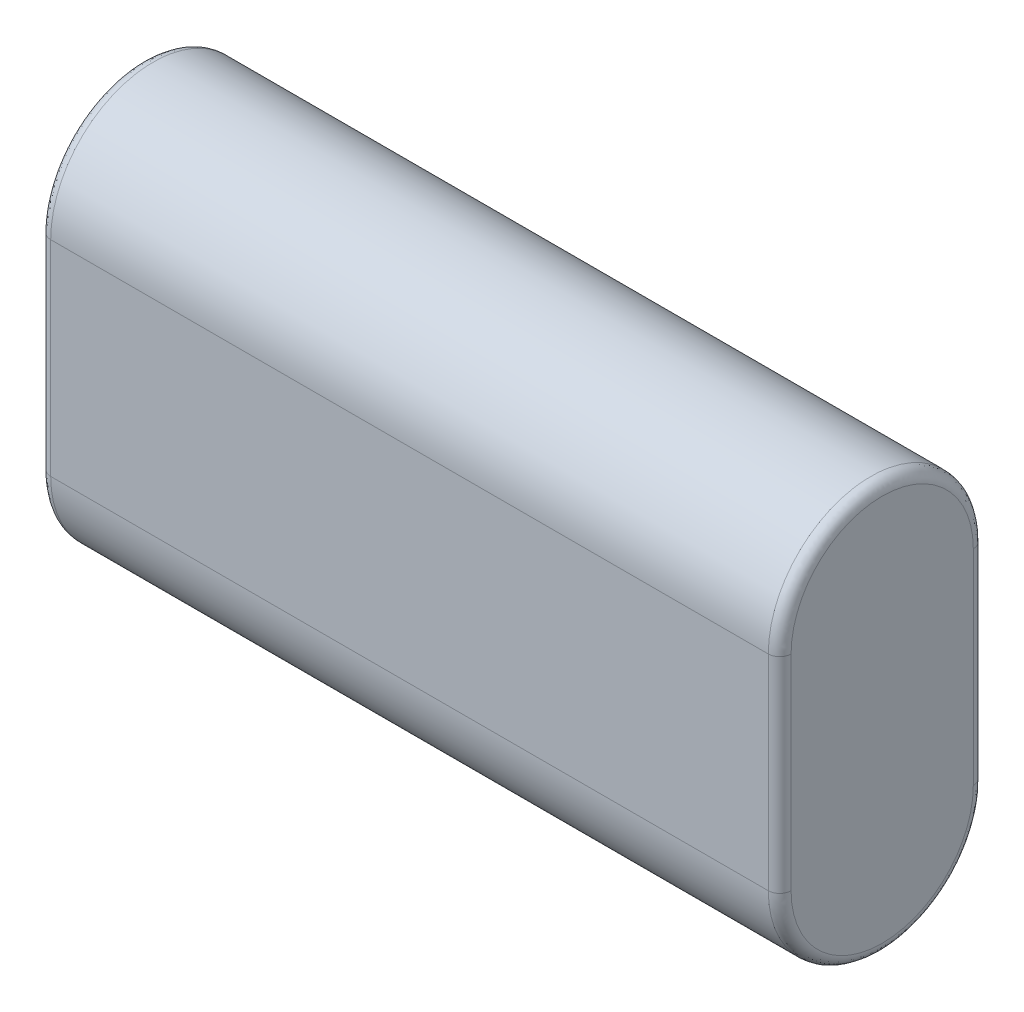
ISO-10303-21;
HEADER;
FILE_DESCRIPTION(('STEP AP214'),'2;1');
FILE_NAME('part.step','',(''),(''),'','','');
FILE_SCHEMA(('AUTOMOTIVE_DESIGN { 1 0 10303 214 1 1 1 1 }'));
ENDSEC;
DATA;
#1=APPLICATION_CONTEXT('core data for automotive mechanical design processes');
#2=APPLICATION_PROTOCOL_DEFINITION('international standard','automotive_design',2000,#1);
#3=PRODUCT_CONTEXT('',#1,'mechanical');
#4=PRODUCT('Part','Part','',(#3));
#5=PRODUCT_RELATED_PRODUCT_CATEGORY('part','',(#4));
#6=PRODUCT_DEFINITION_FORMATION('','',#4);
#7=PRODUCT_DEFINITION_CONTEXT('part definition',#1,'design');
#8=PRODUCT_DEFINITION('design','',#6,#7);
#9=PRODUCT_DEFINITION_SHAPE('','',#8);
#10=(LENGTH_UNIT() NAMED_UNIT(*) SI_UNIT(.MILLI.,.METRE.));
#11=(NAMED_UNIT(*) PLANE_ANGLE_UNIT() SI_UNIT($,.RADIAN.));
#12=(NAMED_UNIT(*) SI_UNIT($,.STERADIAN.) SOLID_ANGLE_UNIT());
#13=UNCERTAINTY_MEASURE_WITH_UNIT(LENGTH_MEASURE(1.E-05),#10,'distance_accuracy_value','');
#14=(GEOMETRIC_REPRESENTATION_CONTEXT(3) GLOBAL_UNCERTAINTY_ASSIGNED_CONTEXT((#13)) GLOBAL_UNIT_ASSIGNED_CONTEXT((#10,
#11,#12)) REPRESENTATION_CONTEXT('',''));
#15=CARTESIAN_POINT('',(0.,0.,0.));
#16=DIRECTION('',(0.,0.,1.));
#17=DIRECTION('',(1.,0.,0.));
#18=AXIS2_PLACEMENT_3D('',#15,#16,#17);
#19=CARTESIAN_POINT('',(275.333688616931,-22.3893536522053,61.1643742049061));
#20=DIRECTION('',(-1.33507032488976E-12,1.,-1.30664861545941E-12));
#21=DIRECTION('',(1.,1.33507032488976E-12,0.));
#22=AXIS2_PLACEMENT_3D('',#19,#20,#21);
#23=CYLINDRICAL_SURFACE('',#22,0.999999999999943);
#24=CARTESIAN_POINT('',(275.333688616931,-13.3893536522568,60.1643742049062));
#25=CARTESIAN_POINT('',(275.333688616931,-31.3893536521565,60.1643742049062));
#26=(BOUNDED_CURVE() B_SPLINE_CURVE(1,(#24,#25),.UNSPECIFIED.,.F.,
.F.) B_SPLINE_CURVE_WITH_KNOTS((2,2),(0.,17.9999999998998),
.UNSPECIFIED.) CURVE() GEOMETRIC_REPRESENTATION_ITEM() RATIONAL_B_SPLINE_CURVE((1.,1.)) REPRESENTATION_ITEM(''));
#27=CARTESIAN_POINT('',(275.333688616931,-13.3893536522568,60.1643742049062));
#28=VERTEX_POINT('',#27);
#29=CARTESIAN_POINT('',(275.333688616931,-31.3893536521565,60.1643742049062));
#30=VERTEX_POINT('',#29);
#31=EDGE_CURVE('E167',#28,#30,#26,.T.);
#32=ORIENTED_EDGE('',*,*,#31,.T.);
#33=CARTESIAN_POINT('',(275.333688615059,-31.389353652161,61.1643742030338));
#34=DIRECTION('',(-6.84223817983434E-12,1.,4.52615722245532E-12));
#35=DIRECTION('',(1.87236537736192E-09,4.52615723526649E-12,-1.));
#36=AXIS2_PLACEMENT_3D('',#33,#34,#35);
#37=CIRCLE('',#36,0.999999998127628);
#38=CARTESIAN_POINT('',(274.333688616931,-31.3893536521679,61.1643742027126));
#39=VERTEX_POINT('',#38);
#40=EDGE_CURVE('E265',#30,#39,#37,.T.);
#41=ORIENTED_EDGE('',*,*,#40,.T.);
#42=CARTESIAN_POINT('',(274.333688616931,-13.3893536522569,61.1643742027126));
#43=CARTESIAN_POINT('',(274.333688616931,-31.3893536521679,61.1643742027126));
#44=(BOUNDED_CURVE() B_SPLINE_CURVE(1,(#42,#43),.UNSPECIFIED.,.F.,
.F.) B_SPLINE_CURVE_WITH_KNOTS((2,2),(0.,17.9999999998998),
.UNSPECIFIED.) CURVE() GEOMETRIC_REPRESENTATION_ITEM() RATIONAL_B_SPLINE_CURVE((1.,1.)) REPRESENTATION_ITEM(''));
#45=CARTESIAN_POINT('',(274.333688616931,-13.3893536522569,61.1643742027126));
#46=VERTEX_POINT('',#45);
#47=EDGE_CURVE('E236',#46,#39,#44,.T.);
#48=ORIENTED_EDGE('',*,*,#47,.F.);
#49=CARTESIAN_POINT('',(275.333688615059,-13.3893536522557,61.1643742030337));
#50=DIRECTION('',(1.17239551585976E-12,-1.,1.05816782335625E-12));
#51=DIRECTION('',(-1.,-1.17239551619952E-12,-3.21087157463879E-10));
#52=AXIS2_PLACEMENT_3D('',#49,#50,#51);
#53=CIRCLE('',#52,0.999999998127464);
#54=EDGE_CURVE('E11',#46,#28,#53,.T.);
#55=ORIENTED_EDGE('',*,*,#54,.T.);
#56=EDGE_LOOP('',(#32,#41,#48,#55));
#57=FACE_BOUND('',#56,.T.);
#58=ADVANCED_FACE('F51',(#57),#23,.T.);
#59=CARTESIAN_POINT('',(338.333688616931,-22.3893536522086,61.164374204906));
#60=DIRECTION('',(2.21530666022311E-12,-1.,-2.07319811307117E-12));
#61=DIRECTION('',(1.,2.21530666022311E-12,0.));
#62=AXIS2_PLACEMENT_3D('',#59,#60,#61);
#63=CYLINDRICAL_SURFACE('',#62,0.999999999999964);
#64=CARTESIAN_POINT('',(338.333688618992,-13.3893536522681,61.1643742028455));
#65=DIRECTION('',(1.13119827194599E-11,-1.,-1.14255272378755E-11));
#66=DIRECTION('',(-2.06063078136926E-09,1.14255272145657E-11,-1.));
#67=AXIS2_PLACEMENT_3D('',#64,#65,#66);
#68=CIRCLE('',#67,0.999999997939412);
#69=CARTESIAN_POINT('',(338.333688616931,-13.3893536522566,60.1643742049061));
#70=VERTEX_POINT('',#69);
#71=CARTESIAN_POINT('',(339.333688616931,-13.3893536522568,61.1643742027125));
#72=VERTEX_POINT('',#71);
#73=EDGE_CURVE('E60',#70,#72,#68,.T.);
#74=ORIENTED_EDGE('',*,*,#73,.T.);
#75=CARTESIAN_POINT('',(339.333688616931,-13.3893536522568,61.1643742027125));
#76=CARTESIAN_POINT('',(339.333688616931,-31.3893536521678,61.1643742027125));
#77=(BOUNDED_CURVE() B_SPLINE_CURVE(1,(#75,#76),.UNSPECIFIED.,.F.,
.F.) B_SPLINE_CURVE_WITH_KNOTS((2,2),(-1.29674049276218E-13,17.9999999998997),
.UNSPECIFIED.) CURVE() GEOMETRIC_REPRESENTATION_ITEM() RATIONAL_B_SPLINE_CURVE((1.,1.)) REPRESENTATION_ITEM(''));
#78=CARTESIAN_POINT('',(339.333688616931,-31.3893536521677,61.1643742027125));
#79=VERTEX_POINT('',#78);
#80=EDGE_CURVE('E148',#72,#79,#77,.T.);
#81=ORIENTED_EDGE('',*,*,#80,.T.);
#82=CARTESIAN_POINT('',(338.333688618803,-31.389353652164,61.1643742030337));
#83=DIRECTION('',(-3.72903620133552E-12,-1.,-7.5566220019752E-12));
#84=DIRECTION('',(-1.87236537736188E-09,7.55662200895732E-12,-1.));
#85=AXIS2_PLACEMENT_3D('',#82,#83,#84);
#86=CIRCLE('',#85,0.999999998127649);
#87=CARTESIAN_POINT('',(338.333688616931,-31.3893536521565,60.1643742049061));
#88=VERTEX_POINT('',#87);
#89=EDGE_CURVE('E254',#88,#79,#86,.T.);
#90=ORIENTED_EDGE('',*,*,#89,.F.);
#91=CARTESIAN_POINT('',(338.333688616931,-13.3893536522566,60.1643742049061));
#92=CARTESIAN_POINT('',(338.333688616931,-31.3893536521565,60.1643742049061));
#93=(BOUNDED_CURVE() B_SPLINE_CURVE(1,(#91,#92),.UNSPECIFIED.,.F.,
.F.) B_SPLINE_CURVE_WITH_KNOTS((2,2),(-1.19015908239817E-13,17.9999999998997),
.UNSPECIFIED.) CURVE() GEOMETRIC_REPRESENTATION_ITEM() RATIONAL_B_SPLINE_CURVE((1.,1.)) REPRESENTATION_ITEM(''));
#94=EDGE_CURVE('E151',#70,#88,#93,.T.);
#95=ORIENTED_EDGE('',*,*,#94,.F.);
#96=EDGE_LOOP('',(#74,#81,#90,#95));
#97=FACE_BOUND('',#96,.T.);
#98=ADVANCED_FACE('F146',(#97),#63,.T.);
#99=CARTESIAN_POINT('',(275.333688616931,-13.3893536522567,78.1643742049061));
#100=CARTESIAN_POINT('',(274.333688616931,-13.3893536522567,78.1643742092933));
#101=CARTESIAN_POINT('',(274.333688616931,-13.389353652234,77.1643742092933));
#102=CARTESIAN_POINT('',(275.333688616931,-4.38935365215649,78.1643742050064));
#103=CARTESIAN_POINT('',(274.333688616931,-4.3893536477694,78.1643742093935));
#104=CARTESIAN_POINT('',(274.333688616931,-5.38935364775774,77.1643742093708));
#105=CARTESIAN_POINT('',(275.333688616931,-4.38935365215648,69.1643742049061));
#106=CARTESIAN_POINT('',(274.333688616931,-4.38935364776935,69.1643742049062));
#107=CARTESIAN_POINT('',(274.333688616931,-5.38935364776934,69.1643742048945));
#108=CARTESIAN_POINT('',(275.333688616931,-4.38935365215648,60.1643742048059));
#109=CARTESIAN_POINT('',(274.333688616931,-4.3893536477693,60.1643742004188));
#110=CARTESIAN_POINT('',(274.333688616931,-5.38935364778094,61.1643742004183));
#111=CARTESIAN_POINT('',(275.333688616931,-13.3893536522567,60.1643742049061));
#112=CARTESIAN_POINT('',(274.333688616931,-13.3893536522566,60.164374200519));
#113=CARTESIAN_POINT('',(274.333688616931,-13.3893536522572,61.164374200519));
#114=(BOUNDED_SURFACE() B_SPLINE_SURFACE(2,2,((#99,#100,#101),(#102,#103,#104),(#105,#106,#107),
(#108,#109,#110),(#111,#112,#113)),.UNSPECIFIED.,.F.,.F.,.F.) B_SPLINE_SURFACE_WITH_KNOTS((3,2,
3),(3,3),(0.,12.5660531298859,25.1321062597719),(0.,1.57079633337563),
.UNSPECIFIED.) GEOMETRIC_REPRESENTATION_ITEM() RATIONAL_B_SPLINE_SURFACE(((1.,0.707106778859905,
1.),(0.707106781182611,0.499999998352032,0.707106781182611),(1.,0.707106778859905,1.),
(0.707106781182611,0.499999998352032,0.707106781182611),(1.,0.707106778859905,1.))) REPRESENTATION_ITEM('') SURFACE());
#115=CARTESIAN_POINT('',(275.333688616931,-13.3893536521564,69.1643742049061));
#116=DIRECTION('',(-1.,0.,0.));
#117=DIRECTION('',(0.,-1.11422969616291E-11,1.));
#118=AXIS2_PLACEMENT_3D('',#115,#116,#117);
#119=CIRCLE('',#118,9.);
#120=CARTESIAN_POINT('',(275.333688616931,-13.3893536522568,78.1643742049062));
#121=VERTEX_POINT('',#120);
#122=EDGE_CURVE('E198',#121,#28,#119,.T.);
#123=CARTESIAN_POINT('',(274.333688616931,-13.3893536521564,69.1643742038093));
#124=DIRECTION('',(-1.,0.,0.));
#125=DIRECTION('',(0.,-1.11157749625801E-11,1.));
#126=AXIS2_PLACEMENT_3D('',#123,#124,#125);
#127=CIRCLE('',#126,8.0000000032904);
#128=CARTESIAN_POINT('',(274.333688616931,-13.3893536522454,77.1643742070997));
#129=VERTEX_POINT('',#128);
#130=EDGE_CURVE('E162',#129,#46,#127,.T.);
#131=CARTESIAN_POINT('',(275.333688615059,-13.3893536522525,77.1643742067786));
#132=DIRECTION('',(-7.08239444687799E-12,-1.,-4.28812540507981E-12));
#133=DIRECTION('',(1.87247906419997E-09,-4.28812541834145E-12,1.));
#134=AXIS2_PLACEMENT_3D('',#131,#132,#133);
#135=CIRCLE('',#134,0.999999998127564);
#136=EDGE_CURVE('E103',#121,#129,#135,.T.);
#137=ORIENTED_EDGE('',*,*,#122,.T.);
#138=ORIENTED_EDGE('',*,*,#54,.F.);
#139=ORIENTED_EDGE('',*,*,#130,.F.);
#140=ORIENTED_EDGE('',*,*,#136,.F.);
#141=EDGE_LOOP('',(#137,#138,#139,#140));
#142=FACE_BOUND('',#141,.T.);
#143=ADVANCED_FACE('F342',(#142),#114,.T.);
#144=CARTESIAN_POINT('',(338.333688616931,-13.3893536522566,78.1643742049061));
#145=CARTESIAN_POINT('',(338.333688616931,-4.3893536521564,78.1643742050062));
#146=CARTESIAN_POINT('',(338.333688616931,-4.38935365215643,69.164374204906));
#147=CARTESIAN_POINT('',(338.333688616931,-4.38935365215646,60.1643742048058));
#148=CARTESIAN_POINT('',(338.333688616931,-13.3893536522567,60.1643742049061));
#149=CARTESIAN_POINT('',(339.333688616931,-13.3893536522567,78.1643742092932));
#150=CARTESIAN_POINT('',(339.333688616931,-4.38935364776927,78.1643742093934));
#151=CARTESIAN_POINT('',(339.333688616931,-4.38935364776928,69.1643742049061));
#152=CARTESIAN_POINT('',(339.333688616931,-4.38935364776929,60.1643742004187));
#153=CARTESIAN_POINT('',(339.333688616931,-13.3893536522567,60.1643742005189));
#154=CARTESIAN_POINT('',(339.333688616931,-13.3893536522339,77.1643742092932));
#155=CARTESIAN_POINT('',(339.333688616931,-5.38935364775765,77.1643742093707));
#156=CARTESIAN_POINT('',(339.333688616931,-5.38935364776928,69.1643742048944));
#157=CARTESIAN_POINT('',(339.333688616931,-5.38935364778091,61.1643742004182));
#158=CARTESIAN_POINT('',(339.333688616931,-13.3893536522572,61.1643742005189));
#159=(BOUNDED_SURFACE() B_SPLINE_SURFACE(2,2,((#144,#145,#146,#147,#148),(#149,#150,#151,#152,
#153),(#154,#155,#156,#157,#158)),.UNSPECIFIED.,.F.,.F.,.F.) B_SPLINE_SURFACE_WITH_KNOTS((3,3),
(3,2,3),(0.,1.57079633337563),(0.,12.5660531298859,25.1321062597718),
.UNSPECIFIED.) GEOMETRIC_REPRESENTATION_ITEM() RATIONAL_B_SPLINE_SURFACE(((1.,0.70710678118261,
1.,0.70710678118261,1.),(0.707106778859906,0.499999998352031,0.707106778859906,
0.499999998352031,0.707106778859906),(1.,0.70710678118261,1.,0.70710678118261,1.))) REPRESENTATION_ITEM('') SURFACE());
#160=CARTESIAN_POINT('',(338.333688618803,-13.3893536522504,77.1643742067782));
#161=DIRECTION('',(-5.09681673901938E-12,1.,6.27231600212336E-12));
#162=DIRECTION('',(-1.87208116026667E-09,-6.27231601166501E-12,1.));
#163=AXIS2_PLACEMENT_3D('',#160,#161,#162);
#164=CIRCLE('',#163,0.999999998127848);
#165=CARTESIAN_POINT('',(338.333688616931,-13.3893536522566,78.1643742049061));
#166=VERTEX_POINT('',#165);
#167=CARTESIAN_POINT('',(339.333688616931,-13.3893536522453,77.1643742070996));
#168=VERTEX_POINT('',#167);
#169=EDGE_CURVE('E138',#166,#168,#164,.T.);
#170=CARTESIAN_POINT('',(339.333688616931,-13.3893536521564,69.1643742038093));
#171=DIRECTION('',(-1.,0.,0.));
#172=DIRECTION('',(0.,-1.11131104273221E-11,1.));
#173=AXIS2_PLACEMENT_3D('',#170,#171,#172);
#174=CIRCLE('',#173,8.00000000329037);
#175=EDGE_CURVE('E158',#168,#72,#174,.T.);
#176=CARTESIAN_POINT('',(338.333688616931,-13.3893536521564,69.164374204906));
#177=DIRECTION('',(-1.,0.,0.));
#178=DIRECTION('',(0.,-1.11407179777719E-11,1.));
#179=AXIS2_PLACEMENT_3D('',#176,#177,#178);
#180=CIRCLE('',#179,9.);
#181=EDGE_CURVE('E199',#166,#70,#180,.T.);
#182=ORIENTED_EDGE('',*,*,#169,.T.);
#183=ORIENTED_EDGE('',*,*,#175,.T.);
#184=ORIENTED_EDGE('',*,*,#73,.F.);
#185=ORIENTED_EDGE('',*,*,#181,.F.);
#186=EDGE_LOOP('',(#182,#183,#184,#185));
#187=FACE_BOUND('',#186,.T.);
#188=ADVANCED_FACE('F164',(#187),#159,.T.);
#189=CARTESIAN_POINT('',(275.333688616931,-22.3893536522082,77.1643742049062));
#190=DIRECTION('',(-1.55096714574319E-12,-1.,1.53675629102814E-12));
#191=DIRECTION('',(1.,-1.55096714574319E-12,0.));
#192=AXIS2_PLACEMENT_3D('',#189,#190,#191);
#193=CYLINDRICAL_SURFACE('',#192,0.999999999999886);
#194=CARTESIAN_POINT('',(275.333688616931,-31.3893536521565,78.1643742049061));
#195=CARTESIAN_POINT('',(275.333688616931,-13.3893536522568,78.1643742049062));
#196=(BOUNDED_CURVE() B_SPLINE_CURVE(1,(#194,#195),.UNSPECIFIED.,.F.,
.F.) B_SPLINE_CURVE_WITH_KNOTS((2,2),(0.,17.9999999998998),
.UNSPECIFIED.) CURVE() GEOMETRIC_REPRESENTATION_ITEM() RATIONAL_B_SPLINE_CURVE((1.,1.)) REPRESENTATION_ITEM(''));
#197=CARTESIAN_POINT('',(275.333688616931,-31.3893536521565,78.1643742049061));
#198=VERTEX_POINT('',#197);
#199=EDGE_CURVE('E188',#198,#121,#196,.T.);
#200=ORIENTED_EDGE('',*,*,#199,.T.);
#201=ORIENTED_EDGE('',*,*,#136,.T.);
#202=CARTESIAN_POINT('',(274.333688616931,-31.3893536521489,77.1643742070997));
#203=CARTESIAN_POINT('',(274.333688616931,-13.3893536522454,77.1643742070997));
#204=(BOUNDED_CURVE() B_SPLINE_CURVE(1,(#202,#203),.UNSPECIFIED.,.F.,
.F.) B_SPLINE_CURVE_WITH_KNOTS((2,2),(0.,17.9999999998998),
.UNSPECIFIED.) CURVE() GEOMETRIC_REPRESENTATION_ITEM() RATIONAL_B_SPLINE_CURVE((1.,1.)) REPRESENTATION_ITEM(''));
#205=CARTESIAN_POINT('',(274.333688616931,-31.3893536521489,77.1643742070997));
#206=VERTEX_POINT('',#205);
#207=EDGE_CURVE('E249',#206,#129,#204,.T.);
#208=ORIENTED_EDGE('',*,*,#207,.F.);
#209=CARTESIAN_POINT('',(275.333688615059,-31.3893536521541,77.1643742067786));
#210=DIRECTION('',(5.17630384048716E-12,1.,2.43618753889424E-12));
#211=DIRECTION('',(-1.,5.17630383970485E-12,3.21122684600715E-10));
#212=AXIS2_PLACEMENT_3D('',#209,#210,#211);
#213=CIRCLE('',#212,0.999999998127521);
#214=EDGE_CURVE('E71',#206,#198,#213,.T.);
#215=ORIENTED_EDGE('',*,*,#214,.T.);
#216=EDGE_LOOP('',(#200,#201,#208,#215));
#217=FACE_BOUND('',#216,.T.);
#218=ADVANCED_FACE('F276',(#217),#193,.T.);
#219=CARTESIAN_POINT('',(338.333688616931,-22.3893536522058,77.164374204906));
#220=DIRECTION('',(7.14834956744861E-13,1.,7.43256666175234E-13));
#221=DIRECTION('',(1.,-7.14834956744861E-13,0.));
#222=AXIS2_PLACEMENT_3D('',#219,#220,#221);
#223=CYLINDRICAL_SURFACE('',#222,1.00000000000007);
#224=CARTESIAN_POINT('',(338.333688618803,-31.3893536521519,77.1643742067785));
#225=DIRECTION('',(3.12283533096614E-12,-1.,-4.52603470617291E-12));
#226=DIRECTION('',(1.,3.12283532951273E-12,3.21122684600679E-10));
#227=AXIS2_PLACEMENT_3D('',#224,#225,#226);
#228=CIRCLE('',#227,0.999999998127635);
#229=CARTESIAN_POINT('',(339.333688616931,-31.3893536521488,77.1643742070996));
#230=VERTEX_POINT('',#229);
#231=CARTESIAN_POINT('',(338.333688616931,-31.3893536521565,78.1643742049061));
#232=VERTEX_POINT('',#231);
#233=EDGE_CURVE('E260',#230,#232,#228,.T.);
#234=ORIENTED_EDGE('',*,*,#233,.F.);
#235=CARTESIAN_POINT('',(339.333688616931,-31.3893536521488,77.1643742070996));
#236=CARTESIAN_POINT('',(339.333688616931,-13.3893536522453,77.1643742070996));
#237=(BOUNDED_CURVE() B_SPLINE_CURVE(1,(#235,#236),.UNSPECIFIED.,.F.,
.F.) B_SPLINE_CURVE_WITH_KNOTS((2,2),(0.,17.9999999998998),
.UNSPECIFIED.) CURVE() GEOMETRIC_REPRESENTATION_ITEM() RATIONAL_B_SPLINE_CURVE((1.,1.)) REPRESENTATION_ITEM(''));
#238=EDGE_CURVE('E166',#230,#168,#237,.T.);
#239=ORIENTED_EDGE('',*,*,#238,.T.);
#240=ORIENTED_EDGE('',*,*,#169,.F.);
#241=CARTESIAN_POINT('',(338.333688616931,-31.3893536521565,78.1643742049061));
#242=CARTESIAN_POINT('',(338.333688616931,-13.3893536522566,78.1643742049061));
#243=(BOUNDED_CURVE() B_SPLINE_CURVE(1,(#241,#242),.UNSPECIFIED.,.F.,
.F.) B_SPLINE_CURVE_WITH_KNOTS((2,2),(0.,17.9999999998998),
.UNSPECIFIED.) CURVE() GEOMETRIC_REPRESENTATION_ITEM() RATIONAL_B_SPLINE_CURVE((1.,1.)) REPRESENTATION_ITEM(''));
#244=EDGE_CURVE('E189',#232,#166,#243,.T.);
#245=ORIENTED_EDGE('',*,*,#244,.F.);
#246=EDGE_LOOP('',(#234,#239,#240,#245));
#247=FACE_BOUND('',#246,.T.);
#248=ADVANCED_FACE('F281',(#247),#223,.T.);
#249=CARTESIAN_POINT('',(275.333688616931,-31.3893536521565,60.1643742049062));
#250=CARTESIAN_POINT('',(274.333688616931,-31.3893536521565,60.164374200519));
#251=CARTESIAN_POINT('',(274.333688616931,-31.3893536521792,61.164374200519));
#252=CARTESIAN_POINT('',(275.333688616931,-40.3893536521565,60.1643742049061));
#253=CARTESIAN_POINT('',(274.333688616931,-40.3893536565437,60.164374200519));
#254=CARTESIAN_POINT('',(274.333688616931,-39.3893536565664,61.1643742005417));
#255=CARTESIAN_POINT('',(275.333688616931,-40.3893536521565,69.1643742049062));
#256=CARTESIAN_POINT('',(274.333688616931,-40.3893536565437,69.1643742049062));
#257=CARTESIAN_POINT('',(274.333688616931,-39.3893536565437,69.1643742049289));
#258=CARTESIAN_POINT('',(275.333688616931,-40.3893536521565,78.1643742049062));
#259=CARTESIAN_POINT('',(274.333688616931,-40.3893536565436,78.1643742092934));
#260=CARTESIAN_POINT('',(274.333688616931,-39.3893536565209,77.1643742093161));
#261=CARTESIAN_POINT('',(275.333688616931,-31.3893536521565,78.1643742049062));
#262=CARTESIAN_POINT('',(274.333688616931,-31.3893536521564,78.1643742092933));
#263=CARTESIAN_POINT('',(274.333688616931,-31.3893536521338,77.1643742092933));
#264=(BOUNDED_SURFACE() B_SPLINE_SURFACE(2,2,((#249,#250,#251),(#252,#253,#254),(#255,#256,
#257),(#258,#259,#260),(#261,#262,#263)),.UNSPECIFIED.,.F.,.F.,
.F.) B_SPLINE_SURFACE_WITH_KNOTS((3,2,3),(3,3),(0.,12.5660531298073,25.1321062596145),(0.,
1.57079633337563),.UNSPECIFIED.) GEOMETRIC_REPRESENTATION_ITEM() RATIONAL_B_SPLINE_SURFACE(((1.,
0.707106778859905,1.),(0.707106781186546,0.499999998354815,0.707106781186546),(1.,
0.707106778859905,1.),(0.707106781186546,0.499999998354815,0.707106781186546),(1.,
0.707106778859905,1.))) REPRESENTATION_ITEM('') SURFACE());
#265=CARTESIAN_POINT('',(275.333688616931,-31.3893536521565,69.1643742049062));
#266=DIRECTION('',(-1.,0.,0.));
#267=DIRECTION('',(0.,0.,-1.));
#268=AXIS2_PLACEMENT_3D('',#265,#266,#267);
#269=CIRCLE('',#268,9.);
#270=EDGE_CURVE('E398',#30,#198,#269,.T.);
#271=CARTESIAN_POINT('',(274.333688616931,-31.3893536521565,69.1643742060029));
#272=DIRECTION('',(-1.,0.,0.));
#273=DIRECTION('',(0.,-1.42685863066139E-12,-1.));
#274=AXIS2_PLACEMENT_3D('',#271,#272,#273);
#275=CIRCLE('',#274,8.00000000329036);
#276=EDGE_CURVE('E242',#39,#206,#275,.T.);
#277=ORIENTED_EDGE('',*,*,#270,.T.);
#278=ORIENTED_EDGE('',*,*,#214,.F.);
#279=ORIENTED_EDGE('',*,*,#276,.F.);
#280=ORIENTED_EDGE('',*,*,#40,.F.);
#281=EDGE_LOOP('',(#277,#278,#279,#280));
#282=FACE_BOUND('',#281,.T.);
#283=ADVANCED_FACE('F350',(#282),#264,.T.);
#284=CARTESIAN_POINT('',(338.333688616931,-31.3893536521564,60.1643742049061));
#285=CARTESIAN_POINT('',(338.333688616931,-40.3893536521564,60.164374204906));
#286=CARTESIAN_POINT('',(338.333688616931,-40.3893536521564,69.1643742049061));
#287=CARTESIAN_POINT('',(338.333688616931,-40.3893536521565,78.164374204906));
#288=CARTESIAN_POINT('',(338.333688616931,-31.3893536521564,78.164374204906));
#289=CARTESIAN_POINT('',(339.333688616931,-31.3893536521564,60.1643742005189));
#290=CARTESIAN_POINT('',(339.333688616932,-40.3893536565436,60.1643742005189));
#291=CARTESIAN_POINT('',(339.333688616931,-40.3893536565436,69.1643742049059));
#292=CARTESIAN_POINT('',(339.333688616932,-40.3893536565436,78.1643742092932));
#293=CARTESIAN_POINT('',(339.333688616931,-31.3893536521564,78.1643742092932));
#294=CARTESIAN_POINT('',(339.333688616931,-31.3893536521792,61.1643742005189));
#295=CARTESIAN_POINT('',(339.333688616931,-39.3893536565663,61.1643742005417));
#296=CARTESIAN_POINT('',(339.333688616931,-39.3893536565436,69.1643742049288));
#297=CARTESIAN_POINT('',(339.333688616931,-39.3893536565208,77.1643742093161));
#298=CARTESIAN_POINT('',(339.333688616931,-31.3893536521337,77.1643742092932));
#299=(BOUNDED_SURFACE() B_SPLINE_SURFACE(2,2,((#284,#285,#286,#287,#288),(#289,#290,#291,#292,
#293),(#294,#295,#296,#297,#298)),.UNSPECIFIED.,.F.,.F.,.F.) B_SPLINE_SURFACE_WITH_KNOTS((3,3),
(3,2,3),(0.,1.57079633337557),(0.,12.5660531298072,25.1321062596145),
.UNSPECIFIED.) GEOMETRIC_REPRESENTATION_ITEM() RATIONAL_B_SPLINE_SURFACE(((1.,0.707106781186546,
1.,0.707106781186546,1.),(0.707106778859929,0.499999998354831,0.707106778859929,
0.499999998354831,0.707106778859929),(1.,0.707106781186546,1.,0.707106781186546,1.))) REPRESENTATION_ITEM('') SURFACE());
#300=CARTESIAN_POINT('',(339.333688616931,-31.3893536521564,69.1643742060028));
#301=DIRECTION('',(-1.,0.,0.));
#302=DIRECTION('',(0.,-1.41797684646805E-12,-1.));
#303=AXIS2_PLACEMENT_3D('',#300,#301,#302);
#304=CIRCLE('',#303,8.00000000329035);
#305=EDGE_CURVE('E160',#79,#230,#304,.T.);
#306=CARTESIAN_POINT('',(338.333688616931,-31.3893536521564,69.1643742049061));
#307=DIRECTION('',(-1.,0.,0.));
#308=DIRECTION('',(0.,0.,-1.));
#309=AXIS2_PLACEMENT_3D('',#306,#307,#308);
#310=CIRCLE('',#309,9.);
#311=EDGE_CURVE('E397',#88,#232,#310,.T.);
#312=ORIENTED_EDGE('',*,*,#89,.T.);
#313=ORIENTED_EDGE('',*,*,#305,.T.);
#314=ORIENTED_EDGE('',*,*,#233,.T.);
#315=ORIENTED_EDGE('',*,*,#311,.F.);
#316=EDGE_LOOP('',(#312,#313,#314,#315));
#317=FACE_BOUND('',#316,.T.);
#318=ADVANCED_FACE('F333',(#317),#299,.T.);
#319=CARTESIAN_POINT('',(274.333688616931,0.110646347843488,57.9143742049062));
#320=DIRECTION('',(-1.,0.,0.));
#321=DIRECTION('',(0.,0.,1.));
#322=AXIS2_PLACEMENT_3D('',#319,#320,#321);
#323=PLANE('',#322);
#324=ORIENTED_EDGE('',*,*,#130,.T.);
#325=ORIENTED_EDGE('',*,*,#47,.T.);
#326=ORIENTED_EDGE('',*,*,#276,.T.);
#327=ORIENTED_EDGE('',*,*,#207,.T.);
#328=EDGE_LOOP('',(#324,#325,#326,#327));
#329=FACE_BOUND('',#328,.T.);
#330=ADVANCED_FACE('F290',(#329),#323,.T.);
#331=CARTESIAN_POINT('',(339.333688616931,0.110646347843545,57.9143742049061));
#332=DIRECTION('',(1.,0.,0.));
#333=DIRECTION('',(0.,1.,0.));
#334=AXIS2_PLACEMENT_3D('',#331,#332,#333);
#335=PLANE('',#334);
#336=ORIENTED_EDGE('',*,*,#175,.F.);
#337=ORIENTED_EDGE('',*,*,#238,.F.);
#338=ORIENTED_EDGE('',*,*,#305,.F.);
#339=ORIENTED_EDGE('',*,*,#80,.F.);
#340=EDGE_LOOP('',(#336,#337,#338,#339));
#341=FACE_BOUND('',#340,.T.);
#342=ADVANCED_FACE('F156',(#341),#335,.T.);
#343=CARTESIAN_POINT('',(339.333688616931,-13.3893536522566,60.1643742049061));
#344=DIRECTION('',(0.,0.,-1.));
#345=DIRECTION('',(0.,-1.,0.));
#346=AXIS2_PLACEMENT_3D('',#343,#344,#345);
#347=PLANE('',#346);
#348=ORIENTED_EDGE('',*,*,#94,.T.);
#349=CARTESIAN_POINT('',(338.333688616931,-31.3893536521565,60.1643742049061));
#350=CARTESIAN_POINT('',(275.333688616931,-31.3893536521565,60.1643742049062));
#351=(BOUNDED_CURVE() B_SPLINE_CURVE(1,(#349,#350),.UNSPECIFIED.,.F.,
.F.) B_SPLINE_CURVE_WITH_KNOTS((2,2),(1.,64.),
.UNSPECIFIED.) CURVE() GEOMETRIC_REPRESENTATION_ITEM() RATIONAL_B_SPLINE_CURVE((1.,1.)) REPRESENTATION_ITEM(''));
#352=EDGE_CURVE('E179',#88,#30,#351,.T.);
#353=ORIENTED_EDGE('',*,*,#352,.T.);
#354=ORIENTED_EDGE('',*,*,#31,.F.);
#355=CARTESIAN_POINT('',(338.333688616931,-13.3893536522566,60.1643742049061));
#356=CARTESIAN_POINT('',(275.333688616931,-13.3893536522568,60.1643742049062));
#357=(BOUNDED_CURVE() B_SPLINE_CURVE(1,(#355,#356),.UNSPECIFIED.,.F.,
.F.) B_SPLINE_CURVE_WITH_KNOTS((2,2),(1.,64.),
.UNSPECIFIED.) CURVE() GEOMETRIC_REPRESENTATION_ITEM() RATIONAL_B_SPLINE_CURVE((1.,1.)) REPRESENTATION_ITEM(''));
#358=EDGE_CURVE('E190',#70,#28,#357,.T.);
#359=ORIENTED_EDGE('',*,*,#358,.F.);
#360=EDGE_LOOP('',(#348,#353,#354,#359));
#361=FACE_BOUND('',#360,.T.);
#362=ADVANCED_FACE('F289',(#361),#347,.T.);
#363=CARTESIAN_POINT('',(306.833688616931,-13.3893536521565,69.1643742049061));
#364=DIRECTION('',(-1.,0.,0.));
#365=DIRECTION('',(0.,-1.,0.));
#366=AXIS2_PLACEMENT_3D('',#363,#364,#365);
#367=CYLINDRICAL_SURFACE('',#366,9.);
#368=CARTESIAN_POINT('',(338.333688616931,-13.3893536522566,78.1643742049061));
#369=CARTESIAN_POINT('',(275.333688616931,-13.3893536522568,78.1643742049062));
#370=(BOUNDED_CURVE() B_SPLINE_CURVE(1,(#368,#369),.UNSPECIFIED.,.F.,
.F.) B_SPLINE_CURVE_WITH_KNOTS((2,2),(1.,64.),
.UNSPECIFIED.) CURVE() GEOMETRIC_REPRESENTATION_ITEM() RATIONAL_B_SPLINE_CURVE((1.,1.)) REPRESENTATION_ITEM(''));
#371=EDGE_CURVE('E183',#166,#121,#370,.T.);
#372=ORIENTED_EDGE('',*,*,#371,.F.);
#373=ORIENTED_EDGE('',*,*,#181,.T.);
#374=ORIENTED_EDGE('',*,*,#358,.T.);
#375=ORIENTED_EDGE('',*,*,#122,.F.);
#376=EDGE_LOOP('',(#372,#373,#374,#375));
#377=FACE_BOUND('',#376,.T.);
#378=ADVANCED_FACE('F298',(#377),#367,.T.);
#379=CARTESIAN_POINT('',(339.333688616931,-31.3893536521565,78.1643742049061));
#380=DIRECTION('',(0.,0.,1.));
#381=DIRECTION('',(1.,0.,0.));
#382=AXIS2_PLACEMENT_3D('',#379,#380,#381);
#383=PLANE('',#382);
#384=ORIENTED_EDGE('',*,*,#244,.T.);
#385=ORIENTED_EDGE('',*,*,#371,.T.);
#386=ORIENTED_EDGE('',*,*,#199,.F.);
#387=CARTESIAN_POINT('',(338.333688616931,-31.3893536521565,78.1643742049061));
#388=CARTESIAN_POINT('',(275.333688616931,-31.3893536521565,78.1643742049061));
#389=(BOUNDED_CURVE() B_SPLINE_CURVE(1,(#387,#388),.UNSPECIFIED.,.F.,
.F.) B_SPLINE_CURVE_WITH_KNOTS((2,2),(1.,64.),
.UNSPECIFIED.) CURVE() GEOMETRIC_REPRESENTATION_ITEM() RATIONAL_B_SPLINE_CURVE((1.,1.)) REPRESENTATION_ITEM(''));
#390=EDGE_CURVE('E401',#232,#198,#389,.T.);
#391=ORIENTED_EDGE('',*,*,#390,.F.);
#392=EDGE_LOOP('',(#384,#385,#386,#391));
#393=FACE_BOUND('',#392,.T.);
#394=ADVANCED_FACE('F308',(#393),#383,.T.);
#395=CARTESIAN_POINT('',(306.833688616931,-31.3893536521565,69.1643742049061));
#396=DIRECTION('',(-1.,0.,0.));
#397=DIRECTION('',(0.,-1.,0.));
#398=AXIS2_PLACEMENT_3D('',#395,#396,#397);
#399=CYLINDRICAL_SURFACE('',#398,9.);
#400=ORIENTED_EDGE('',*,*,#311,.T.);
#401=ORIENTED_EDGE('',*,*,#390,.T.);
#402=ORIENTED_EDGE('',*,*,#270,.F.);
#403=ORIENTED_EDGE('',*,*,#352,.F.);
#404=EDGE_LOOP('',(#400,#401,#402,#403));
#405=FACE_BOUND('',#404,.T.);
#406=ADVANCED_FACE('F304',(#405),#399,.T.);
#407=CLOSED_SHELL('',(#58,#98,#143,#188,#218,#248,#283,#318,#330,#342,#362,#378,#394,#406));
#408=MANIFOLD_SOLID_BREP('B2',#407);
#409=ADVANCED_BREP_SHAPE_REPRESENTATION('',(#18,#408),#14);
#410=SHAPE_DEFINITION_REPRESENTATION(#9,#409);
ENDSEC;
END-ISO-10303-21;
